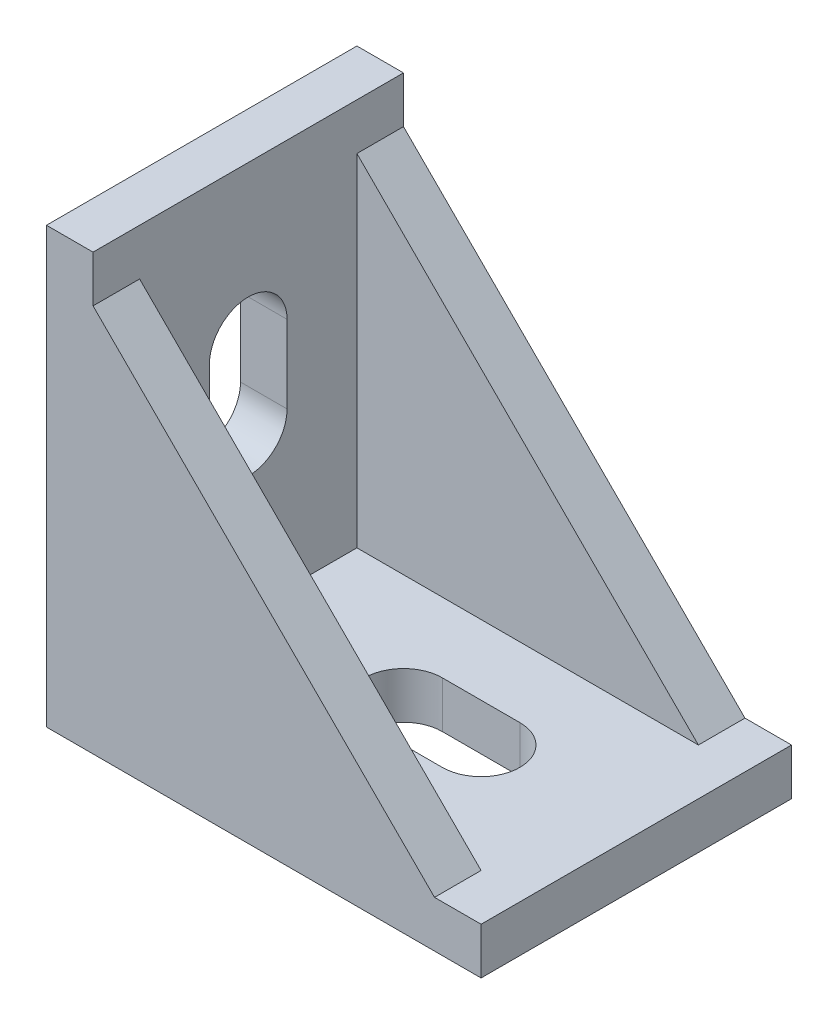
ISO-10303-21;
HEADER;
FILE_DESCRIPTION(('STEP AP214'),'2;1');
FILE_NAME('part.step','',(''),(''),'','','');
FILE_SCHEMA(('AUTOMOTIVE_DESIGN { 1 0 10303 214 1 1 1 1 }'));
ENDSEC;
DATA;
#1=APPLICATION_CONTEXT('core data for automotive mechanical design processes');
#2=APPLICATION_PROTOCOL_DEFINITION('international standard','automotive_design',2000,#1);
#3=PRODUCT_CONTEXT('',#1,'mechanical');
#4=PRODUCT('Part','Part','',(#3));
#5=PRODUCT_RELATED_PRODUCT_CATEGORY('part','',(#4));
#6=PRODUCT_DEFINITION_FORMATION('','',#4);
#7=PRODUCT_DEFINITION_CONTEXT('part definition',#1,'design');
#8=PRODUCT_DEFINITION('design','',#6,#7);
#9=PRODUCT_DEFINITION_SHAPE('','',#8);
#10=(LENGTH_UNIT() NAMED_UNIT(*) SI_UNIT(.MILLI.,.METRE.));
#11=(NAMED_UNIT(*) PLANE_ANGLE_UNIT() SI_UNIT($,.RADIAN.));
#12=(NAMED_UNIT(*) SI_UNIT($,.STERADIAN.) SOLID_ANGLE_UNIT());
#13=UNCERTAINTY_MEASURE_WITH_UNIT(LENGTH_MEASURE(1.E-05),#10,'distance_accuracy_value','');
#14=(GEOMETRIC_REPRESENTATION_CONTEXT(3) GLOBAL_UNCERTAINTY_ASSIGNED_CONTEXT((#13)) GLOBAL_UNIT_ASSIGNED_CONTEXT((#10,
#11,#12)) REPRESENTATION_CONTEXT('',''));
#15=CARTESIAN_POINT('',(0.,0.,0.));
#16=DIRECTION('',(0.,0.,1.));
#17=DIRECTION('',(1.,0.,0.));
#18=AXIS2_PLACEMENT_3D('',#15,#16,#17);
#19=CARTESIAN_POINT('',(25.,3.,-20.));
#20=DIRECTION('',(0.707106781186548,0.707106781186548,0.));
#21=DIRECTION('',(-0.707106781186548,0.707106781186548,0.));
#22=AXIS2_PLACEMENT_3D('',#19,#20,#21);
#23=PLANE('',#22);
#24=DIRECTION('',(0.,0.,1.));
#25=VECTOR('',#24,1.);
#26=CARTESIAN_POINT('',(3.,25.,-20.));
#27=LINE('',#26,#25);
#28=CARTESIAN_POINT('',(3.,25.,-20.));
#29=VERTEX_POINT('',#28);
#30=CARTESIAN_POINT('',(3.,25.,-17.));
#31=VERTEX_POINT('',#30);
#32=EDGE_CURVE('E286',#29,#31,#27,.T.);
#33=ORIENTED_EDGE('',*,*,#32,.T.);
#34=DIRECTION('',(-0.707106781186548,0.707106781186548,0.));
#35=VECTOR('',#34,1.);
#36=CARTESIAN_POINT('',(25.,3.,-17.));
#37=LINE('',#36,#35);
#38=CARTESIAN_POINT('',(25.,3.,-17.));
#39=VERTEX_POINT('',#38);
#40=EDGE_CURVE('E224',#39,#31,#37,.T.);
#41=ORIENTED_EDGE('',*,*,#40,.F.);
#42=DIRECTION('',(0.,0.,1.));
#43=VECTOR('',#42,1.);
#44=CARTESIAN_POINT('',(25.,3.,-20.));
#45=LINE('',#44,#43);
#46=CARTESIAN_POINT('',(25.,3.,-20.));
#47=VERTEX_POINT('',#46);
#48=EDGE_CURVE('E290',#47,#39,#45,.T.);
#49=ORIENTED_EDGE('',*,*,#48,.F.);
#50=DIRECTION('',(-0.707106781186548,0.707106781186548,0.));
#51=VECTOR('',#50,1.);
#52=CARTESIAN_POINT('',(25.,3.,-20.));
#53=LINE('',#52,#51);
#54=EDGE_CURVE('E252',#47,#29,#53,.T.);
#55=ORIENTED_EDGE('',*,*,#54,.T.);
#56=EDGE_LOOP('',(#33,#41,#49,#55));
#57=FACE_BOUND('',#56,.T.);
#58=ADVANCED_FACE('F33',(#57),#23,.T.);
#59=CARTESIAN_POINT('',(0.,0.,-20.));
#60=DIRECTION('',(0.,-1.,0.));
#61=DIRECTION('',(0.,0.,-1.));
#62=AXIS2_PLACEMENT_3D('',#59,#60,#61);
#63=PLANE('',#62);
#64=CARTESIAN_POINT('',(18.,0.,-10.));
#65=DIRECTION('',(0.,-1.,0.));
#66=DIRECTION('',(0.,0.,-1.));
#67=AXIS2_PLACEMENT_3D('',#64,#65,#66);
#68=CIRCLE('',#67,2.5);
#69=CARTESIAN_POINT('',(18.,0.,-12.5));
#70=VERTEX_POINT('',#69);
#71=CARTESIAN_POINT('',(18.,0.,-7.5));
#72=VERTEX_POINT('',#71);
#73=EDGE_CURVE('E221',#70,#72,#68,.T.);
#74=ORIENTED_EDGE('',*,*,#73,.F.);
#75=DIRECTION('',(1.,0.,0.));
#76=VECTOR('',#75,1.);
#77=CARTESIAN_POINT('',(0.,0.,-12.5));
#78=LINE('',#77,#76);
#79=CARTESIAN_POINT('',(13.,0.,-12.5));
#80=VERTEX_POINT('',#79);
#81=EDGE_CURVE('E208',#80,#70,#78,.T.);
#82=ORIENTED_EDGE('',*,*,#81,.F.);
#83=CARTESIAN_POINT('',(13.,0.,-10.));
#84=DIRECTION('',(0.,-1.,0.));
#85=DIRECTION('',(0.,0.,-1.));
#86=AXIS2_PLACEMENT_3D('',#83,#84,#85);
#87=CIRCLE('',#86,2.5);
#88=CARTESIAN_POINT('',(13.,0.,-7.50000000000001));
#89=VERTEX_POINT('',#88);
#90=EDGE_CURVE('E216',#89,#80,#87,.T.);
#91=ORIENTED_EDGE('',*,*,#90,.F.);
#92=DIRECTION('',(-1.,0.,0.));
#93=VECTOR('',#92,1.);
#94=CARTESIAN_POINT('',(0.,0.,-7.50000000000003));
#95=LINE('',#94,#93);
#96=EDGE_CURVE('E219',#72,#89,#95,.T.);
#97=ORIENTED_EDGE('',*,*,#96,.F.);
#98=EDGE_LOOP('',(#74,#82,#91,#97));
#99=FACE_BOUND('',#98,.T.);
#100=DIRECTION('',(1.,0.,0.));
#101=VECTOR('',#100,1.);
#102=CARTESIAN_POINT('',(0.,0.,0.));
#103=LINE('',#102,#101);
#104=CARTESIAN_POINT('',(0.,0.,0.));
#105=VERTEX_POINT('',#104);
#106=CARTESIAN_POINT('',(28.,0.,0.));
#107=VERTEX_POINT('',#106);
#108=EDGE_CURVE('E241',#105,#107,#103,.T.);
#109=ORIENTED_EDGE('',*,*,#108,.F.);
#110=DIRECTION('',(0.,0.,1.));
#111=VECTOR('',#110,1.);
#112=CARTESIAN_POINT('',(0.,0.,-20.));
#113=LINE('',#112,#111);
#114=CARTESIAN_POINT('',(0.,0.,-20.));
#115=VERTEX_POINT('',#114);
#116=EDGE_CURVE('E11',#115,#105,#113,.T.);
#117=ORIENTED_EDGE('',*,*,#116,.F.);
#118=DIRECTION('',(1.,0.,0.));
#119=VECTOR('',#118,1.);
#120=CARTESIAN_POINT('',(0.,0.,-20.));
#121=LINE('',#120,#119);
#122=CARTESIAN_POINT('',(28.,0.,-20.));
#123=VERTEX_POINT('',#122);
#124=EDGE_CURVE('E242',#115,#123,#121,.T.);
#125=ORIENTED_EDGE('',*,*,#124,.T.);
#126=DIRECTION('',(0.,0.,1.));
#127=VECTOR('',#126,1.);
#128=CARTESIAN_POINT('',(28.,0.,-20.));
#129=LINE('',#128,#127);
#130=EDGE_CURVE('E37',#123,#107,#129,.T.);
#131=ORIENTED_EDGE('',*,*,#130,.T.);
#132=EDGE_LOOP('',(#109,#117,#125,#131));
#133=FACE_BOUND('',#132,.T.);
#134=ADVANCED_FACE('F35',(#99,#133),#63,.T.);
#135=CARTESIAN_POINT('',(0.,0.,-20.));
#136=DIRECTION('',(-1.,0.,0.));
#137=DIRECTION('',(0.,0.,1.));
#138=AXIS2_PLACEMENT_3D('',#135,#136,#137);
#139=PLANE('',#138);
#140=CARTESIAN_POINT('',(0.,13.,-10.));
#141=DIRECTION('',(-1.,0.,0.));
#142=DIRECTION('',(0.,0.,1.));
#143=AXIS2_PLACEMENT_3D('',#140,#141,#142);
#144=CIRCLE('',#143,2.5);
#145=CARTESIAN_POINT('',(0.,13.,-12.5));
#146=VERTEX_POINT('',#145);
#147=CARTESIAN_POINT('',(0.,13.,-7.5));
#148=VERTEX_POINT('',#147);
#149=EDGE_CURVE('E192',#146,#148,#144,.T.);
#150=ORIENTED_EDGE('',*,*,#149,.F.);
#151=DIRECTION('',(0.,-1.,0.));
#152=VECTOR('',#151,1.);
#153=CARTESIAN_POINT('',(0.,0.,-12.5));
#154=LINE('',#153,#152);
#155=CARTESIAN_POINT('',(0.,18.,-12.5));
#156=VERTEX_POINT('',#155);
#157=EDGE_CURVE('E185',#156,#146,#154,.T.);
#158=ORIENTED_EDGE('',*,*,#157,.F.);
#159=CARTESIAN_POINT('',(0.,18.,-10.));
#160=DIRECTION('',(-1.,0.,0.));
#161=DIRECTION('',(0.,0.,1.));
#162=AXIS2_PLACEMENT_3D('',#159,#160,#161);
#163=CIRCLE('',#162,2.5);
#164=CARTESIAN_POINT('',(0.,18.,-7.5));
#165=VERTEX_POINT('',#164);
#166=EDGE_CURVE('E165',#165,#156,#163,.T.);
#167=ORIENTED_EDGE('',*,*,#166,.F.);
#168=DIRECTION('',(0.,1.,0.));
#169=VECTOR('',#168,1.);
#170=CARTESIAN_POINT('',(0.,0.,-7.50000000000001));
#171=LINE('',#170,#169);
#172=EDGE_CURVE('E190',#148,#165,#171,.T.);
#173=ORIENTED_EDGE('',*,*,#172,.F.);
#174=EDGE_LOOP('',(#150,#158,#167,#173));
#175=FACE_BOUND('',#174,.T.);
#176=DIRECTION('',(0.,-1.,0.));
#177=VECTOR('',#176,1.);
#178=CARTESIAN_POINT('',(0.,0.,0.));
#179=LINE('',#178,#177);
#180=CARTESIAN_POINT('',(0.,28.,0.));
#181=VERTEX_POINT('',#180);
#182=EDGE_CURVE('E246',#181,#105,#179,.T.);
#183=ORIENTED_EDGE('',*,*,#182,.F.);
#184=DIRECTION('',(0.,0.,1.));
#185=VECTOR('',#184,1.);
#186=CARTESIAN_POINT('',(0.,28.,-20.));
#187=LINE('',#186,#185);
#188=CARTESIAN_POINT('',(0.,28.,-20.));
#189=VERTEX_POINT('',#188);
#190=EDGE_CURVE('E42',#189,#181,#187,.T.);
#191=ORIENTED_EDGE('',*,*,#190,.F.);
#192=DIRECTION('',(0.,-1.,0.));
#193=VECTOR('',#192,1.);
#194=CARTESIAN_POINT('',(0.,0.,-20.));
#195=LINE('',#194,#193);
#196=EDGE_CURVE('E261',#189,#115,#195,.T.);
#197=ORIENTED_EDGE('',*,*,#196,.T.);
#198=ORIENTED_EDGE('',*,*,#116,.T.);
#199=EDGE_LOOP('',(#183,#191,#197,#198));
#200=FACE_BOUND('',#199,.T.);
#201=ADVANCED_FACE('F307',(#175,#200),#139,.T.);
#202=CARTESIAN_POINT('',(0.,28.,-20.));
#203=DIRECTION('',(0.,1.,0.));
#204=DIRECTION('',(0.,0.,1.));
#205=AXIS2_PLACEMENT_3D('',#202,#203,#204);
#206=PLANE('',#205);
#207=DIRECTION('',(-1.,0.,0.));
#208=VECTOR('',#207,1.);
#209=CARTESIAN_POINT('',(0.,28.,0.));
#210=LINE('',#209,#208);
#211=CARTESIAN_POINT('',(3.,28.,0.));
#212=VERTEX_POINT('',#211);
#213=EDGE_CURVE('E278',#212,#181,#210,.T.);
#214=ORIENTED_EDGE('',*,*,#213,.F.);
#215=DIRECTION('',(0.,0.,1.));
#216=VECTOR('',#215,1.);
#217=CARTESIAN_POINT('',(3.,28.,-20.));
#218=LINE('',#217,#216);
#219=CARTESIAN_POINT('',(3.,28.,-20.));
#220=VERTEX_POINT('',#219);
#221=EDGE_CURVE('E284',#220,#212,#218,.T.);
#222=ORIENTED_EDGE('',*,*,#221,.F.);
#223=DIRECTION('',(-1.,0.,0.));
#224=VECTOR('',#223,1.);
#225=CARTESIAN_POINT('',(0.,28.,-20.));
#226=LINE('',#225,#224);
#227=EDGE_CURVE('E258',#220,#189,#226,.T.);
#228=ORIENTED_EDGE('',*,*,#227,.T.);
#229=ORIENTED_EDGE('',*,*,#190,.T.);
#230=EDGE_LOOP('',(#214,#222,#228,#229));
#231=FACE_BOUND('',#230,.T.);
#232=ADVANCED_FACE('F326',(#231),#206,.T.);
#233=CARTESIAN_POINT('',(3.,28.,-20.));
#234=DIRECTION('',(1.,0.,0.));
#235=DIRECTION('',(0.,1.,0.));
#236=AXIS2_PLACEMENT_3D('',#233,#234,#235);
#237=PLANE('',#236);
#238=CARTESIAN_POINT('',(3.,13.,-10.));
#239=DIRECTION('',(1.,0.,0.));
#240=DIRECTION('',(0.,1.,0.));
#241=AXIS2_PLACEMENT_3D('',#238,#239,#240);
#242=CIRCLE('',#241,2.5);
#243=CARTESIAN_POINT('',(3.,13.,-7.5));
#244=VERTEX_POINT('',#243);
#245=CARTESIAN_POINT('',(3.,13.,-12.5));
#246=VERTEX_POINT('',#245);
#247=EDGE_CURVE('E58',#244,#246,#242,.T.);
#248=ORIENTED_EDGE('',*,*,#247,.F.);
#249=DIRECTION('',(0.,-1.,0.));
#250=VECTOR('',#249,1.);
#251=CARTESIAN_POINT('',(3.,13.,-7.5));
#252=LINE('',#251,#250);
#253=CARTESIAN_POINT('',(3.,18.,-7.5));
#254=VERTEX_POINT('',#253);
#255=EDGE_CURVE('E178',#254,#244,#252,.T.);
#256=ORIENTED_EDGE('',*,*,#255,.F.);
#257=CARTESIAN_POINT('',(3.,18.,-10.));
#258=DIRECTION('',(1.,0.,0.));
#259=DIRECTION('',(0.,1.,0.));
#260=AXIS2_PLACEMENT_3D('',#257,#258,#259);
#261=CIRCLE('',#260,2.5);
#262=CARTESIAN_POINT('',(3.,18.,-12.5));
#263=VERTEX_POINT('',#262);
#264=EDGE_CURVE('E162',#263,#254,#261,.T.);
#265=ORIENTED_EDGE('',*,*,#264,.F.);
#266=DIRECTION('',(0.,1.,0.));
#267=VECTOR('',#266,1.);
#268=CARTESIAN_POINT('',(3.,13.,-12.5));
#269=LINE('',#268,#267);
#270=EDGE_CURVE('E171',#246,#263,#269,.T.);
#271=ORIENTED_EDGE('',*,*,#270,.F.);
#272=EDGE_LOOP('',(#248,#256,#265,#271));
#273=FACE_BOUND('',#272,.T.);
#274=DIRECTION('',(0.,1.,0.));
#275=VECTOR('',#274,1.);
#276=CARTESIAN_POINT('',(3.,28.,0.));
#277=LINE('',#276,#275);
#278=CARTESIAN_POINT('',(3.,25.,0.));
#279=VERTEX_POINT('',#278);
#280=EDGE_CURVE('E275',#279,#212,#277,.T.);
#281=ORIENTED_EDGE('',*,*,#280,.F.);
#282=CARTESIAN_POINT('',(3.,25.,-3.));
#283=VERTEX_POINT('',#282);
#284=EDGE_CURVE('E289',#283,#279,#27,.T.);
#285=ORIENTED_EDGE('',*,*,#284,.F.);
#286=DIRECTION('',(0.,-1.,0.));
#287=VECTOR('',#286,1.);
#288=CARTESIAN_POINT('',(3.,25.,-3.));
#289=LINE('',#288,#287);
#290=CARTESIAN_POINT('',(3.,3.,-3.));
#291=VERTEX_POINT('',#290);
#292=EDGE_CURVE('E236',#283,#291,#289,.T.);
#293=ORIENTED_EDGE('',*,*,#292,.T.);
#294=DIRECTION('',(0.,0.,1.));
#295=VECTOR('',#294,1.);
#296=CARTESIAN_POINT('',(3.,3.,-17.));
#297=LINE('',#296,#295);
#298=CARTESIAN_POINT('',(3.,3.,-17.));
#299=VERTEX_POINT('',#298);
#300=EDGE_CURVE('E233',#299,#291,#297,.T.);
#301=ORIENTED_EDGE('',*,*,#300,.F.);
#302=DIRECTION('',(0.,-1.,0.));
#303=VECTOR('',#302,1.);
#304=CARTESIAN_POINT('',(3.,25.,-17.));
#305=LINE('',#304,#303);
#306=EDGE_CURVE('E227',#31,#299,#305,.T.);
#307=ORIENTED_EDGE('',*,*,#306,.F.);
#308=ORIENTED_EDGE('',*,*,#32,.F.);
#309=DIRECTION('',(0.,1.,0.));
#310=VECTOR('',#309,1.);
#311=CARTESIAN_POINT('',(3.,28.,-20.));
#312=LINE('',#311,#310);
#313=EDGE_CURVE('E255',#29,#220,#312,.T.);
#314=ORIENTED_EDGE('',*,*,#313,.T.);
#315=ORIENTED_EDGE('',*,*,#221,.T.);
#316=EDGE_LOOP('',(#281,#285,#293,#301,#307,#308,#314,#315));
#317=FACE_BOUND('',#316,.T.);
#318=ADVANCED_FACE('F175',(#273,#317),#237,.T.);
#319=DIRECTION('',(-0.707106781186548,0.707106781186548,0.));
#320=VECTOR('',#319,1.);
#321=CARTESIAN_POINT('',(25.,3.,-3.));
#322=LINE('',#321,#320);
#323=CARTESIAN_POINT('',(25.,3.,-3.));
#324=VERTEX_POINT('',#323);
#325=EDGE_CURVE('E223',#324,#283,#322,.T.);
#326=ORIENTED_EDGE('',*,*,#325,.T.);
#327=ORIENTED_EDGE('',*,*,#284,.T.);
#328=DIRECTION('',(-0.707106781186548,0.707106781186548,0.));
#329=VECTOR('',#328,1.);
#330=CARTESIAN_POINT('',(25.,3.,0.));
#331=LINE('',#330,#329);
#332=CARTESIAN_POINT('',(25.,3.,0.));
#333=VERTEX_POINT('',#332);
#334=EDGE_CURVE('E272',#333,#279,#331,.T.);
#335=ORIENTED_EDGE('',*,*,#334,.F.);
#336=EDGE_CURVE('E292',#324,#333,#45,.T.);
#337=ORIENTED_EDGE('',*,*,#336,.F.);
#338=EDGE_LOOP('',(#326,#327,#335,#337));
#339=FACE_BOUND('',#338,.T.);
#340=ADVANCED_FACE('F322',(#339),#23,.T.);
#341=CARTESIAN_POINT('',(28.,3.,-20.));
#342=DIRECTION('',(0.,1.,0.));
#343=DIRECTION('',(0.,0.,1.));
#344=AXIS2_PLACEMENT_3D('',#341,#342,#343);
#345=PLANE('',#344);
#346=CARTESIAN_POINT('',(18.,3.,-10.));
#347=DIRECTION('',(0.,1.,0.));
#348=DIRECTION('',(0.,0.,1.));
#349=AXIS2_PLACEMENT_3D('',#346,#347,#348);
#350=CIRCLE('',#349,2.5);
#351=CARTESIAN_POINT('',(18.,3.,-7.5));
#352=VERTEX_POINT('',#351);
#353=CARTESIAN_POINT('',(18.,3.,-12.5));
#354=VERTEX_POINT('',#353);
#355=EDGE_CURVE('E194',#352,#354,#350,.T.);
#356=ORIENTED_EDGE('',*,*,#355,.F.);
#357=DIRECTION('',(1.,0.,0.));
#358=VECTOR('',#357,1.);
#359=CARTESIAN_POINT('',(18.,3.,-7.5));
#360=LINE('',#359,#358);
#361=CARTESIAN_POINT('',(13.,3.,-7.50000000000001));
#362=VERTEX_POINT('',#361);
#363=EDGE_CURVE('E202',#362,#352,#360,.T.);
#364=ORIENTED_EDGE('',*,*,#363,.F.);
#365=CARTESIAN_POINT('',(13.,3.,-10.));
#366=DIRECTION('',(0.,1.,0.));
#367=DIRECTION('',(0.,0.,1.));
#368=AXIS2_PLACEMENT_3D('',#365,#366,#367);
#369=CIRCLE('',#368,2.5);
#370=CARTESIAN_POINT('',(13.,3.,-12.5));
#371=VERTEX_POINT('',#370);
#372=EDGE_CURVE('E199',#371,#362,#369,.T.);
#373=ORIENTED_EDGE('',*,*,#372,.F.);
#374=DIRECTION('',(-1.,0.,0.));
#375=VECTOR('',#374,1.);
#376=CARTESIAN_POINT('',(18.,3.,-12.5));
#377=LINE('',#376,#375);
#378=EDGE_CURVE('E196',#354,#371,#377,.T.);
#379=ORIENTED_EDGE('',*,*,#378,.F.);
#380=EDGE_LOOP('',(#356,#364,#373,#379));
#381=FACE_BOUND('',#380,.T.);
#382=DIRECTION('',(-1.,0.,0.));
#383=VECTOR('',#382,1.);
#384=CARTESIAN_POINT('',(28.,3.,0.));
#385=LINE('',#384,#383);
#386=CARTESIAN_POINT('',(28.,3.,0.));
#387=VERTEX_POINT('',#386);
#388=EDGE_CURVE('E269',#387,#333,#385,.T.);
#389=ORIENTED_EDGE('',*,*,#388,.F.);
#390=DIRECTION('',(0.,0.,1.));
#391=VECTOR('',#390,1.);
#392=CARTESIAN_POINT('',(28.,3.,-20.));
#393=LINE('',#392,#391);
#394=CARTESIAN_POINT('',(28.,3.,-20.));
#395=VERTEX_POINT('',#394);
#396=EDGE_CURVE('E293',#395,#387,#393,.T.);
#397=ORIENTED_EDGE('',*,*,#396,.F.);
#398=DIRECTION('',(-1.,0.,0.));
#399=VECTOR('',#398,1.);
#400=CARTESIAN_POINT('',(28.,3.,-20.));
#401=LINE('',#400,#399);
#402=EDGE_CURVE('E249',#395,#47,#401,.T.);
#403=ORIENTED_EDGE('',*,*,#402,.T.);
#404=ORIENTED_EDGE('',*,*,#48,.T.);
#405=DIRECTION('',(1.,0.,0.));
#406=VECTOR('',#405,1.);
#407=CARTESIAN_POINT('',(3.,3.,-17.));
#408=LINE('',#407,#406);
#409=EDGE_CURVE('E231',#299,#39,#408,.T.);
#410=ORIENTED_EDGE('',*,*,#409,.F.);
#411=ORIENTED_EDGE('',*,*,#300,.T.);
#412=DIRECTION('',(1.,0.,0.));
#413=VECTOR('',#412,1.);
#414=CARTESIAN_POINT('',(3.,3.,-3.));
#415=LINE('',#414,#413);
#416=EDGE_CURVE('E228',#291,#324,#415,.T.);
#417=ORIENTED_EDGE('',*,*,#416,.T.);
#418=ORIENTED_EDGE('',*,*,#336,.T.);
#419=EDGE_LOOP('',(#389,#397,#403,#404,#410,#411,#417,#418));
#420=FACE_BOUND('',#419,.T.);
#421=ADVANCED_FACE('F316',(#381,#420),#345,.T.);
#422=CARTESIAN_POINT('',(28.,0.,-20.));
#423=DIRECTION('',(1.,0.,0.));
#424=DIRECTION('',(0.,0.,-1.));
#425=AXIS2_PLACEMENT_3D('',#422,#423,#424);
#426=PLANE('',#425);
#427=DIRECTION('',(0.,1.,0.));
#428=VECTOR('',#427,1.);
#429=CARTESIAN_POINT('',(28.,0.,0.));
#430=LINE('',#429,#428);
#431=EDGE_CURVE('E266',#107,#387,#430,.T.);
#432=ORIENTED_EDGE('',*,*,#431,.F.);
#433=ORIENTED_EDGE('',*,*,#130,.F.);
#434=DIRECTION('',(0.,1.,0.));
#435=VECTOR('',#434,1.);
#436=CARTESIAN_POINT('',(28.,0.,-20.));
#437=LINE('',#436,#435);
#438=EDGE_CURVE('E245',#123,#395,#437,.T.);
#439=ORIENTED_EDGE('',*,*,#438,.T.);
#440=ORIENTED_EDGE('',*,*,#396,.T.);
#441=EDGE_LOOP('',(#432,#433,#439,#440));
#442=FACE_BOUND('',#441,.T.);
#443=ADVANCED_FACE('F301',(#442),#426,.T.);
#444=CARTESIAN_POINT('',(0.,0.,-20.));
#445=DIRECTION('',(0.,0.,1.));
#446=DIRECTION('',(1.,0.,0.));
#447=AXIS2_PLACEMENT_3D('',#444,#445,#446);
#448=PLANE('',#447);
#449=ORIENTED_EDGE('',*,*,#124,.F.);
#450=ORIENTED_EDGE('',*,*,#196,.F.);
#451=ORIENTED_EDGE('',*,*,#227,.F.);
#452=ORIENTED_EDGE('',*,*,#313,.F.);
#453=ORIENTED_EDGE('',*,*,#54,.F.);
#454=ORIENTED_EDGE('',*,*,#402,.F.);
#455=ORIENTED_EDGE('',*,*,#438,.F.);
#456=EDGE_LOOP('',(#449,#450,#451,#452,#453,#454,#455));
#457=FACE_BOUND('',#456,.T.);
#458=ADVANCED_FACE('F310',(#457),#448,.F.);
#459=CARTESIAN_POINT('',(0.,0.,0.));
#460=DIRECTION('',(0.,0.,1.));
#461=DIRECTION('',(1.,0.,0.));
#462=AXIS2_PLACEMENT_3D('',#459,#460,#461);
#463=PLANE('',#462);
#464=ORIENTED_EDGE('',*,*,#108,.T.);
#465=ORIENTED_EDGE('',*,*,#431,.T.);
#466=ORIENTED_EDGE('',*,*,#388,.T.);
#467=ORIENTED_EDGE('',*,*,#334,.T.);
#468=ORIENTED_EDGE('',*,*,#280,.T.);
#469=ORIENTED_EDGE('',*,*,#213,.T.);
#470=ORIENTED_EDGE('',*,*,#182,.T.);
#471=EDGE_LOOP('',(#464,#465,#466,#467,#468,#469,#470));
#472=FACE_BOUND('',#471,.T.);
#473=ADVANCED_FACE('F303',(#472),#463,.T.);
#474=CARTESIAN_POINT('',(0.,0.,-17.));
#475=DIRECTION('',(0.,0.,1.));
#476=DIRECTION('',(1.,0.,0.));
#477=AXIS2_PLACEMENT_3D('',#474,#475,#476);
#478=PLANE('',#477);
#479=ORIENTED_EDGE('',*,*,#40,.T.);
#480=ORIENTED_EDGE('',*,*,#306,.T.);
#481=ORIENTED_EDGE('',*,*,#409,.T.);
#482=EDGE_LOOP('',(#479,#480,#481));
#483=FACE_BOUND('',#482,.T.);
#484=ADVANCED_FACE('F330',(#483),#478,.T.);
#485=CARTESIAN_POINT('',(0.,0.,-3.));
#486=DIRECTION('',(0.,0.,1.));
#487=DIRECTION('',(1.,0.,0.));
#488=AXIS2_PLACEMENT_3D('',#485,#486,#487);
#489=PLANE('',#488);
#490=ORIENTED_EDGE('',*,*,#325,.F.);
#491=ORIENTED_EDGE('',*,*,#416,.F.);
#492=ORIENTED_EDGE('',*,*,#292,.F.);
#493=EDGE_LOOP('',(#490,#491,#492));
#494=FACE_BOUND('',#493,.T.);
#495=ADVANCED_FACE('F333',(#494),#489,.F.);
#496=CARTESIAN_POINT('',(18.,-11.,-10.));
#497=DIRECTION('',(0.,1.,0.));
#498=DIRECTION('',(0.,0.,1.));
#499=AXIS2_PLACEMENT_3D('',#496,#497,#498);
#500=CYLINDRICAL_SURFACE('',#499,2.5);
#501=ORIENTED_EDGE('',*,*,#73,.T.);
#502=DIRECTION('',(0.,1.,0.));
#503=VECTOR('',#502,1.);
#504=CARTESIAN_POINT('',(18.,-11.,-7.5));
#505=LINE('',#504,#503);
#506=EDGE_CURVE('E206',#72,#352,#505,.T.);
#507=ORIENTED_EDGE('',*,*,#506,.T.);
#508=ORIENTED_EDGE('',*,*,#355,.T.);
#509=DIRECTION('',(0.,1.,0.));
#510=VECTOR('',#509,1.);
#511=CARTESIAN_POINT('',(18.,-11.,-12.5));
#512=LINE('',#511,#510);
#513=EDGE_CURVE('E205',#70,#354,#512,.T.);
#514=ORIENTED_EDGE('',*,*,#513,.F.);
#515=EDGE_LOOP('',(#501,#507,#508,#514));
#516=FACE_BOUND('',#515,.T.);
#517=ADVANCED_FACE('F335',(#516),#500,.F.);
#518=CARTESIAN_POINT('',(18.,-11.,-7.5));
#519=DIRECTION('',(0.,0.,1.));
#520=DIRECTION('',(1.,0.,0.));
#521=AXIS2_PLACEMENT_3D('',#518,#519,#520);
#522=PLANE('',#521);
#523=ORIENTED_EDGE('',*,*,#96,.T.);
#524=DIRECTION('',(0.,1.,0.));
#525=VECTOR('',#524,1.);
#526=CARTESIAN_POINT('',(13.,-11.,-7.50000000000001));
#527=LINE('',#526,#525);
#528=EDGE_CURVE('E209',#89,#362,#527,.T.);
#529=ORIENTED_EDGE('',*,*,#528,.T.);
#530=ORIENTED_EDGE('',*,*,#363,.T.);
#531=ORIENTED_EDGE('',*,*,#506,.F.);
#532=EDGE_LOOP('',(#523,#529,#530,#531));
#533=FACE_BOUND('',#532,.T.);
#534=ADVANCED_FACE('F341',(#533),#522,.F.);
#535=CARTESIAN_POINT('',(13.,-11.,-10.));
#536=DIRECTION('',(0.,1.,0.));
#537=DIRECTION('',(0.,0.,1.));
#538=AXIS2_PLACEMENT_3D('',#535,#536,#537);
#539=CYLINDRICAL_SURFACE('',#538,2.5);
#540=ORIENTED_EDGE('',*,*,#90,.T.);
#541=DIRECTION('',(0.,1.,0.));
#542=VECTOR('',#541,1.);
#543=CARTESIAN_POINT('',(13.,-11.,-12.5));
#544=LINE('',#543,#542);
#545=EDGE_CURVE('E211',#80,#371,#544,.T.);
#546=ORIENTED_EDGE('',*,*,#545,.T.);
#547=ORIENTED_EDGE('',*,*,#372,.T.);
#548=ORIENTED_EDGE('',*,*,#528,.F.);
#549=EDGE_LOOP('',(#540,#546,#547,#548));
#550=FACE_BOUND('',#549,.T.);
#551=ADVANCED_FACE('F402',(#550),#539,.F.);
#552=CARTESIAN_POINT('',(18.,-11.,-12.5));
#553=DIRECTION('',(0.,0.,-1.));
#554=DIRECTION('',(-1.,0.,0.));
#555=AXIS2_PLACEMENT_3D('',#552,#553,#554);
#556=PLANE('',#555);
#557=ORIENTED_EDGE('',*,*,#81,.T.);
#558=ORIENTED_EDGE('',*,*,#513,.T.);
#559=ORIENTED_EDGE('',*,*,#378,.T.);
#560=ORIENTED_EDGE('',*,*,#545,.F.);
#561=EDGE_LOOP('',(#557,#558,#559,#560));
#562=FACE_BOUND('',#561,.T.);
#563=ADVANCED_FACE('F412',(#562),#556,.F.);
#564=CARTESIAN_POINT('',(-11.,13.,-10.));
#565=DIRECTION('',(1.,0.,0.));
#566=DIRECTION('',(0.,1.,0.));
#567=AXIS2_PLACEMENT_3D('',#564,#565,#566);
#568=CYLINDRICAL_SURFACE('',#567,2.5);
#569=ORIENTED_EDGE('',*,*,#149,.T.);
#570=DIRECTION('',(1.,0.,0.));
#571=VECTOR('',#570,1.);
#572=CARTESIAN_POINT('',(-11.,13.,-7.5));
#573=LINE('',#572,#571);
#574=EDGE_CURVE('E183',#148,#244,#573,.T.);
#575=ORIENTED_EDGE('',*,*,#574,.T.);
#576=ORIENTED_EDGE('',*,*,#247,.T.);
#577=DIRECTION('',(1.,0.,0.));
#578=VECTOR('',#577,1.);
#579=CARTESIAN_POINT('',(-11.,13.,-12.5));
#580=LINE('',#579,#578);
#581=EDGE_CURVE('E168',#146,#246,#580,.T.);
#582=ORIENTED_EDGE('',*,*,#581,.F.);
#583=EDGE_LOOP('',(#569,#575,#576,#582));
#584=FACE_BOUND('',#583,.T.);
#585=ADVANCED_FACE('F422',(#584),#568,.F.);
#586=CARTESIAN_POINT('',(-11.,13.,-7.5));
#587=DIRECTION('',(0.,0.,1.));
#588=DIRECTION('',(0.,-1.,0.));
#589=AXIS2_PLACEMENT_3D('',#586,#587,#588);
#590=PLANE('',#589);
#591=ORIENTED_EDGE('',*,*,#172,.T.);
#592=DIRECTION('',(1.,0.,0.));
#593=VECTOR('',#592,1.);
#594=CARTESIAN_POINT('',(-11.,18.,-7.5));
#595=LINE('',#594,#593);
#596=EDGE_CURVE('E167',#165,#254,#595,.T.);
#597=ORIENTED_EDGE('',*,*,#596,.T.);
#598=ORIENTED_EDGE('',*,*,#255,.T.);
#599=ORIENTED_EDGE('',*,*,#574,.F.);
#600=EDGE_LOOP('',(#591,#597,#598,#599));
#601=FACE_BOUND('',#600,.T.);
#602=ADVANCED_FACE('F444',(#601),#590,.F.);
#603=CARTESIAN_POINT('',(-11.,18.,-10.));
#604=DIRECTION('',(1.,0.,0.));
#605=DIRECTION('',(0.,1.,0.));
#606=AXIS2_PLACEMENT_3D('',#603,#604,#605);
#607=CYLINDRICAL_SURFACE('',#606,2.5);
#608=ORIENTED_EDGE('',*,*,#166,.T.);
#609=DIRECTION('',(1.,0.,0.));
#610=VECTOR('',#609,1.);
#611=CARTESIAN_POINT('',(-11.,18.,-12.5));
#612=LINE('',#611,#610);
#613=EDGE_CURVE('E50',#156,#263,#612,.T.);
#614=ORIENTED_EDGE('',*,*,#613,.T.);
#615=ORIENTED_EDGE('',*,*,#264,.T.);
#616=ORIENTED_EDGE('',*,*,#596,.F.);
#617=EDGE_LOOP('',(#608,#614,#615,#616));
#618=FACE_BOUND('',#617,.T.);
#619=ADVANCED_FACE('F159',(#618),#607,.F.);
#620=CARTESIAN_POINT('',(-11.,13.,-12.5));
#621=DIRECTION('',(0.,0.,-1.));
#622=DIRECTION('',(0.,1.,0.));
#623=AXIS2_PLACEMENT_3D('',#620,#621,#622);
#624=PLANE('',#623);
#625=ORIENTED_EDGE('',*,*,#157,.T.);
#626=ORIENTED_EDGE('',*,*,#581,.T.);
#627=ORIENTED_EDGE('',*,*,#270,.T.);
#628=ORIENTED_EDGE('',*,*,#613,.F.);
#629=EDGE_LOOP('',(#625,#626,#627,#628));
#630=FACE_BOUND('',#629,.T.);
#631=ADVANCED_FACE('F172',(#630),#624,.F.);
#632=CLOSED_SHELL('',(#58,#134,#201,#232,#318,#340,#421,#443,#458,#473,#484,#495,#517,#534,#551,
#563,#585,#602,#619,#631));
#633=MANIFOLD_SOLID_BREP('B2',#632);
#634=ADVANCED_BREP_SHAPE_REPRESENTATION('',(#18,#633),#14);
#635=SHAPE_DEFINITION_REPRESENTATION(#9,#634);
ENDSEC;
END-ISO-10303-21;
